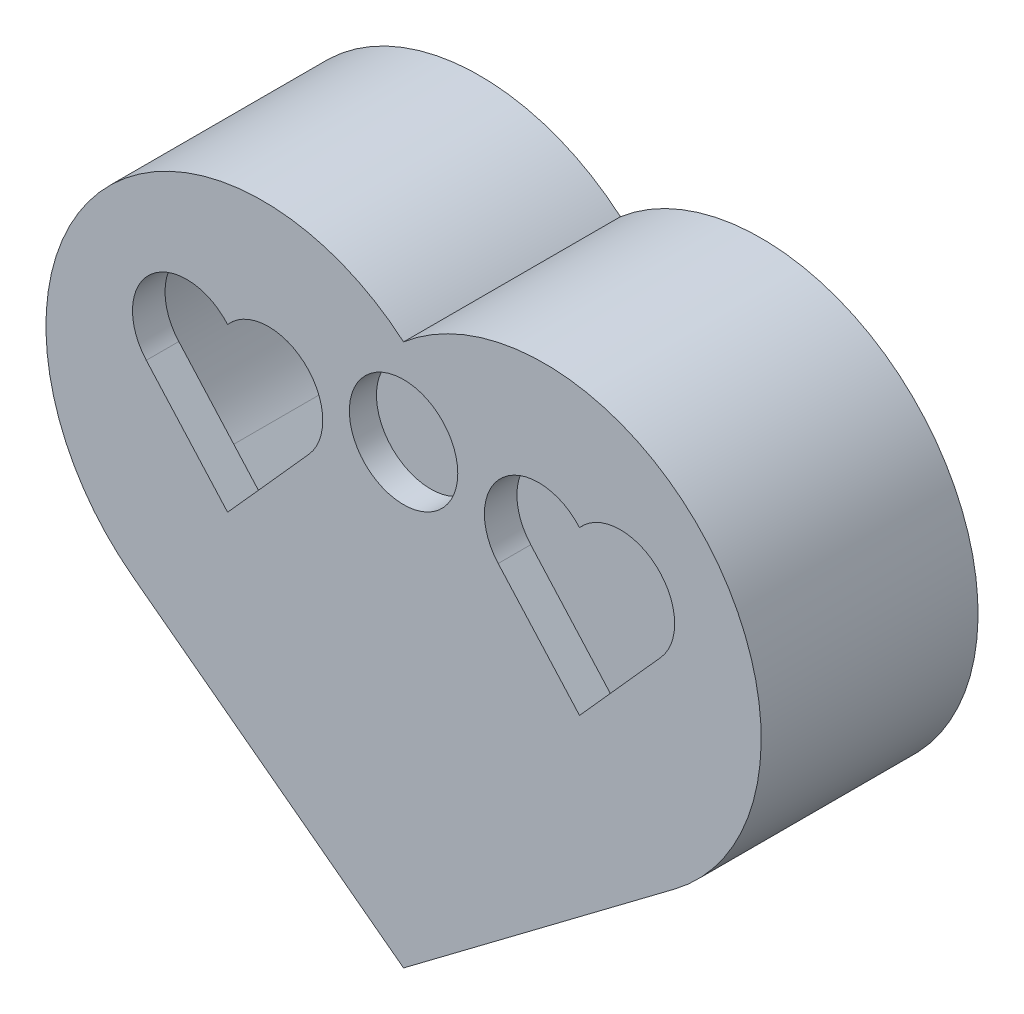
ISO-10303-21;
HEADER;
FILE_DESCRIPTION(('STEP AP214'),'2;1');
FILE_NAME('part.step','',(''),(''),'','','');
FILE_SCHEMA(('AUTOMOTIVE_DESIGN { 1 0 10303 214 1 1 1 1 }'));
ENDSEC;
DATA;
#1=APPLICATION_CONTEXT('core data for automotive mechanical design processes');
#2=APPLICATION_PROTOCOL_DEFINITION('international standard','automotive_design',2000,#1);
#3=PRODUCT_CONTEXT('',#1,'mechanical');
#4=PRODUCT('Part','Part','',(#3));
#5=PRODUCT_RELATED_PRODUCT_CATEGORY('part','',(#4));
#6=PRODUCT_DEFINITION_FORMATION('','',#4);
#7=PRODUCT_DEFINITION_CONTEXT('part definition',#1,'design');
#8=PRODUCT_DEFINITION('design','',#6,#7);
#9=PRODUCT_DEFINITION_SHAPE('','',#8);
#10=(LENGTH_UNIT() NAMED_UNIT(*) SI_UNIT(.MILLI.,.METRE.));
#11=(NAMED_UNIT(*) PLANE_ANGLE_UNIT() SI_UNIT($,.RADIAN.));
#12=(NAMED_UNIT(*) SI_UNIT($,.STERADIAN.) SOLID_ANGLE_UNIT());
#13=UNCERTAINTY_MEASURE_WITH_UNIT(LENGTH_MEASURE(1.E-05),#10,'distance_accuracy_value','');
#14=(GEOMETRIC_REPRESENTATION_CONTEXT(3) GLOBAL_UNCERTAINTY_ASSIGNED_CONTEXT((#13)) GLOBAL_UNIT_ASSIGNED_CONTEXT((#10,
#11,#12)) REPRESENTATION_CONTEXT('',''));
#15=CARTESIAN_POINT('',(0.,0.,0.));
#16=DIRECTION('',(0.,0.,1.));
#17=DIRECTION('',(1.,0.,0.));
#18=AXIS2_PLACEMENT_3D('',#15,#16,#17);
#19=CARTESIAN_POINT('',(-12.1768680961466,52.9084341167665,10.));
#20=DIRECTION('',(0.,0.,-1.));
#21=DIRECTION('',(-1.,0.,0.));
#22=AXIS2_PLACEMENT_3D('',#19,#20,#21);
#23=CYLINDRICAL_SURFACE('',#22,20.0000000000001);
#24=CARTESIAN_POINT('',(-12.1768680961466,52.9084341167665,-10.));
#25=DIRECTION('',(0.,0.,1.));
#26=DIRECTION('',(-1.,0.,0.));
#27=AXIS2_PLACEMENT_3D('',#24,#25,#26);
#28=CIRCLE('',#27,20.0000000000001);
#29=CARTESIAN_POINT('',(0.802992861017529,68.1243208649218,-10.));
#30=VERTEX_POINT('',#29);
#31=CARTESIAN_POINT('',(-24.1970071389825,36.9235582213804,-10.));
#32=VERTEX_POINT('',#31);
#33=EDGE_CURVE('E332',#30,#32,#28,.T.);
#34=ORIENTED_EDGE('',*,*,#33,.T.);
#35=DIRECTION('',(0.,0.,-1.));
#36=VECTOR('',#35,1.);
#37=CARTESIAN_POINT('',(-24.1970071389825,36.9235582213804,10.));
#38=LINE('',#37,#36);
#39=CARTESIAN_POINT('',(-24.1970071389825,36.9235582213804,10.));
#40=VERTEX_POINT('',#39);
#41=EDGE_CURVE('E361',#40,#32,#38,.T.);
#42=ORIENTED_EDGE('',*,*,#41,.F.);
#43=CARTESIAN_POINT('',(-12.1768680961466,52.9084341167665,10.));
#44=DIRECTION('',(0.,0.,1.));
#45=DIRECTION('',(-1.,0.,0.));
#46=AXIS2_PLACEMENT_3D('',#43,#44,#45);
#47=CIRCLE('',#46,20.0000000000001);
#48=CARTESIAN_POINT('',(0.802992861017529,68.1243208649218,10.));
#49=VERTEX_POINT('',#48);
#50=EDGE_CURVE('E335',#49,#40,#47,.T.);
#51=ORIENTED_EDGE('',*,*,#50,.F.);
#52=DIRECTION('',(0.,0.,-1.));
#53=VECTOR('',#52,1.);
#54=CARTESIAN_POINT('',(0.802992861017529,68.1243208649218,10.));
#55=LINE('',#54,#53);
#56=EDGE_CURVE('E345',#49,#30,#55,.T.);
#57=ORIENTED_EDGE('',*,*,#56,.T.);
#58=EDGE_LOOP('',(#34,#42,#51,#57));
#59=FACE_BOUND('',#58,.T.);
#60=ADVANCED_FACE('F36',(#59),#23,.T.);
#61=CARTESIAN_POINT('',(-24.1970071389825,36.9235582213804,10.));
#62=DIRECTION('',(0.601006952141792,0.799243794769302,0.));
#63=DIRECTION('',(-0.799243794769302,0.601006952141792,0.));
#64=AXIS2_PLACEMENT_3D('',#61,#62,#63);
#65=PLANE('',#64);
#66=DIRECTION('',(0.799243794769302,-0.601006952141792,0.));
#67=VECTOR('',#66,1.);
#68=CARTESIAN_POINT('',(-24.1970071389825,36.9235582213804,-10.));
#69=LINE('',#68,#67);
#70=CARTESIAN_POINT('',(0.802992861017527,18.1243208649218,-10.));
#71=VERTEX_POINT('',#70);
#72=EDGE_CURVE('E348',#32,#71,#69,.T.);
#73=ORIENTED_EDGE('',*,*,#72,.T.);
#74=DIRECTION('',(0.,0.,-1.));
#75=VECTOR('',#74,1.);
#76=CARTESIAN_POINT('',(0.802992861017527,18.1243208649218,10.));
#77=LINE('',#76,#75);
#78=CARTESIAN_POINT('',(0.802992861017527,18.1243208649218,10.));
#79=VERTEX_POINT('',#78);
#80=EDGE_CURVE('E358',#79,#71,#77,.T.);
#81=ORIENTED_EDGE('',*,*,#80,.F.);
#82=DIRECTION('',(0.799243794769302,-0.601006952141792,0.));
#83=VECTOR('',#82,1.);
#84=CARTESIAN_POINT('',(-24.1970071389825,36.9235582213804,10.));
#85=LINE('',#84,#83);
#86=EDGE_CURVE('E338',#40,#79,#85,.T.);
#87=ORIENTED_EDGE('',*,*,#86,.F.);
#88=ORIENTED_EDGE('',*,*,#41,.T.);
#89=EDGE_LOOP('',(#73,#81,#87,#88));
#90=FACE_BOUND('',#89,.T.);
#91=ADVANCED_FACE('F402',(#90),#65,.F.);
#92=CARTESIAN_POINT('',(0.802992861017527,18.1243208649218,10.));
#93=DIRECTION('',(-0.601006952141793,0.799243794769301,0.));
#94=DIRECTION('',(-0.799243794769301,-0.601006952141793,0.));
#95=AXIS2_PLACEMENT_3D('',#92,#93,#94);
#96=PLANE('',#95);
#97=DIRECTION('',(0.799243794769301,0.601006952141793,0.));
#98=VECTOR('',#97,1.);
#99=CARTESIAN_POINT('',(0.802992861017527,18.1243208649218,-10.));
#100=LINE('',#99,#98);
#101=CARTESIAN_POINT('',(25.8029928610175,36.9235582213804,-10.));
#102=VERTEX_POINT('',#101);
#103=EDGE_CURVE('E350',#71,#102,#100,.T.);
#104=ORIENTED_EDGE('',*,*,#103,.T.);
#105=DIRECTION('',(0.,0.,-1.));
#106=VECTOR('',#105,1.);
#107=CARTESIAN_POINT('',(25.8029928610175,36.9235582213804,10.));
#108=LINE('',#107,#106);
#109=CARTESIAN_POINT('',(25.8029928610175,36.9235582213804,10.));
#110=VERTEX_POINT('',#109);
#111=EDGE_CURVE('E355',#110,#102,#108,.T.);
#112=ORIENTED_EDGE('',*,*,#111,.F.);
#113=DIRECTION('',(0.799243794769301,0.601006952141793,0.));
#114=VECTOR('',#113,1.);
#115=CARTESIAN_POINT('',(0.802992861017527,18.1243208649218,10.));
#116=LINE('',#115,#114);
#117=EDGE_CURVE('E341',#79,#110,#116,.T.);
#118=ORIENTED_EDGE('',*,*,#117,.F.);
#119=ORIENTED_EDGE('',*,*,#80,.T.);
#120=EDGE_LOOP('',(#104,#112,#118,#119));
#121=FACE_BOUND('',#120,.T.);
#122=ADVANCED_FACE('F407',(#121),#96,.F.);
#123=CARTESIAN_POINT('',(13.7828538181817,52.9084341167665,10.));
#124=DIRECTION('',(0.,0.,-1.));
#125=DIRECTION('',(-1.,0.,0.));
#126=AXIS2_PLACEMENT_3D('',#123,#124,#125);
#127=CYLINDRICAL_SURFACE('',#126,20.);
#128=CARTESIAN_POINT('',(13.7828538181817,52.9084341167665,-10.));
#129=DIRECTION('',(0.,0.,1.));
#130=DIRECTION('',(1.,0.,0.));
#131=AXIS2_PLACEMENT_3D('',#128,#129,#130);
#132=CIRCLE('',#131,20.);
#133=EDGE_CURVE('E339',#102,#30,#132,.T.);
#134=ORIENTED_EDGE('',*,*,#133,.T.);
#135=ORIENTED_EDGE('',*,*,#56,.F.);
#136=CARTESIAN_POINT('',(13.7828538181817,52.9084341167665,10.));
#137=DIRECTION('',(0.,0.,1.));
#138=DIRECTION('',(1.,0.,0.));
#139=AXIS2_PLACEMENT_3D('',#136,#137,#138);
#140=CIRCLE('',#139,20.);
#141=EDGE_CURVE('E343',#110,#49,#140,.T.);
#142=ORIENTED_EDGE('',*,*,#141,.F.);
#143=ORIENTED_EDGE('',*,*,#111,.T.);
#144=EDGE_LOOP('',(#134,#135,#142,#143));
#145=FACE_BOUND('',#144,.T.);
#146=ADVANCED_FACE('F423',(#145),#127,.T.);
#147=CARTESIAN_POINT('',(-12.1768680961466,52.9084341167665,10.));
#148=DIRECTION('',(0.,0.,-1.));
#149=DIRECTION('',(-1.,0.,0.));
#150=AXIS2_PLACEMENT_3D('',#147,#148,#149);
#151=PLANE('',#150);
#152=CARTESIAN_POINT('',(-19.1970071389825,58.1243208649218,10.));
#153=DIRECTION('',(0.,0.,-1.));
#154=DIRECTION('',(-1.,0.,0.));
#155=AXIS2_PLACEMENT_3D('',#152,#153,#154);
#156=CIRCLE('',#155,5.);
#157=CARTESIAN_POINT('',(-22.9239322435525,54.7911498124665,10.));
#158=VERTEX_POINT('',#157);
#159=CARTESIAN_POINT('',(-15.4239322435525,61.40516006145,10.));
#160=VERTEX_POINT('',#159);
#161=EDGE_CURVE('E219',#158,#160,#156,.T.);
#162=ORIENTED_EDGE('',*,*,#161,.T.);
#163=CARTESIAN_POINT('',(-11.6508573481225,58.1243208649218,10.));
#164=DIRECTION('',(0.,0.,-1.));
#165=DIRECTION('',(1.,0.,0.));
#166=AXIS2_PLACEMENT_3D('',#163,#164,#165);
#167=CIRCLE('',#166,5.);
#168=CARTESIAN_POINT('',(-7.92393224355246,54.7911498124665,10.));
#169=VERTEX_POINT('',#168);
#170=EDGE_CURVE('E203',#160,#169,#167,.T.);
#171=ORIENTED_EDGE('',*,*,#170,.T.);
#172=DIRECTION('',(-0.666634210491059,-0.745385020913999,0.));
#173=VECTOR('',#172,1.);
#174=CARTESIAN_POINT('',(-7.92393224355246,54.7911498124665,10.));
#175=LINE('',#174,#173);
#176=CARTESIAN_POINT('',(-15.4239322435525,46.40516006145,10.));
#177=VERTEX_POINT('',#176);
#178=EDGE_CURVE('E211',#169,#177,#175,.T.);
#179=ORIENTED_EDGE('',*,*,#178,.T.);
#180=DIRECTION('',(-0.666634210491059,0.745385020913999,0.));
#181=VECTOR('',#180,1.);
#182=CARTESIAN_POINT('',(-15.4239322435525,46.40516006145,10.));
#183=LINE('',#182,#181);
#184=EDGE_CURVE('E50',#177,#158,#183,.T.);
#185=ORIENTED_EDGE('',*,*,#184,.T.);
#186=EDGE_LOOP('',(#162,#171,#179,#185));
#187=FACE_BOUND('',#186,.T.);
#188=DIRECTION('',(-0.666634210491059,0.745385020913999,0.));
#189=VECTOR('',#188,1.);
#190=CARTESIAN_POINT('',(17.0299179655875,46.40516006145,10.));
#191=LINE('',#190,#189);
#192=CARTESIAN_POINT('',(17.0299179655875,46.40516006145,10.));
#193=VERTEX_POINT('',#192);
#194=CARTESIAN_POINT('',(9.52991796558753,54.7911498124665,10.));
#195=VERTEX_POINT('',#194);
#196=EDGE_CURVE('E253',#193,#195,#191,.T.);
#197=ORIENTED_EDGE('',*,*,#196,.T.);
#198=CARTESIAN_POINT('',(13.2568430701575,58.1243208649218,10.));
#199=DIRECTION('',(0.,0.,-1.));
#200=DIRECTION('',(-1.,0.,0.));
#201=AXIS2_PLACEMENT_3D('',#198,#199,#200);
#202=CIRCLE('',#201,5.);
#203=CARTESIAN_POINT('',(17.0299179655875,61.40516006145,10.));
#204=VERTEX_POINT('',#203);
#205=EDGE_CURVE('E245',#195,#204,#202,.T.);
#206=ORIENTED_EDGE('',*,*,#205,.T.);
#207=CARTESIAN_POINT('',(20.8029928610175,58.1243208649218,10.));
#208=DIRECTION('',(0.,0.,-1.));
#209=DIRECTION('',(1.,0.,0.));
#210=AXIS2_PLACEMENT_3D('',#207,#208,#209);
#211=CIRCLE('',#210,5.);
#212=CARTESIAN_POINT('',(24.5299179655875,54.7911498124665,10.));
#213=VERTEX_POINT('',#212);
#214=EDGE_CURVE('E248',#204,#213,#211,.T.);
#215=ORIENTED_EDGE('',*,*,#214,.T.);
#216=DIRECTION('',(-0.666634210491058,-0.745385020913999,0.));
#217=VECTOR('',#216,1.);
#218=CARTESIAN_POINT('',(17.0299179655875,46.40516006145,10.));
#219=LINE('',#218,#217);
#220=EDGE_CURVE('E58',#213,#193,#219,.T.);
#221=ORIENTED_EDGE('',*,*,#220,.T.);
#222=EDGE_LOOP('',(#197,#206,#215,#221));
#223=FACE_BOUND('',#222,.T.);
#224=CARTESIAN_POINT('',(0.80299286101753,60.1243208649218,10.));
#225=DIRECTION('',(0.,0.,1.));
#226=DIRECTION('',(1.,0.,0.));
#227=AXIS2_PLACEMENT_3D('',#224,#225,#226);
#228=CIRCLE('',#227,5.);
#229=CARTESIAN_POINT('',(5.80299286101753,60.1243208649218,10.));
#230=VERTEX_POINT('',#229);
#231=EDGE_CURVE('E323',#230,#230,#228,.T.);
#232=ORIENTED_EDGE('',*,*,#231,.F.);
#233=EDGE_LOOP('',(#232));
#234=FACE_BOUND('',#233,.T.);
#235=ORIENTED_EDGE('',*,*,#50,.T.);
#236=ORIENTED_EDGE('',*,*,#86,.T.);
#237=ORIENTED_EDGE('',*,*,#117,.T.);
#238=ORIENTED_EDGE('',*,*,#141,.T.);
#239=EDGE_LOOP('',(#235,#236,#237,#238));
#240=FACE_BOUND('',#239,.T.);
#241=ADVANCED_FACE('F216',(#187,#223,#234,#240),#151,.F.);
#242=CARTESIAN_POINT('',(-12.1768680961466,52.9084341167665,-10.));
#243=DIRECTION('',(0.,0.,-1.));
#244=DIRECTION('',(-1.,0.,0.));
#245=AXIS2_PLACEMENT_3D('',#242,#243,#244);
#246=PLANE('',#245);
#247=CARTESIAN_POINT('',(-11.6508573481225,58.1243208649218,-10.));
#248=DIRECTION('',(0.,0.,-1.));
#249=DIRECTION('',(1.,0.,0.));
#250=AXIS2_PLACEMENT_3D('',#247,#248,#249);
#251=CIRCLE('',#250,5.);
#252=CARTESIAN_POINT('',(-15.4239322435525,61.40516006145,-10.));
#253=VERTEX_POINT('',#252);
#254=CARTESIAN_POINT('',(-7.92393224355246,54.7911498124665,-10.));
#255=VERTEX_POINT('',#254);
#256=EDGE_CURVE('E228',#253,#255,#251,.T.);
#257=ORIENTED_EDGE('',*,*,#256,.F.);
#258=CARTESIAN_POINT('',(-19.1970071389825,58.1243208649218,-10.));
#259=DIRECTION('',(0.,0.,-1.));
#260=DIRECTION('',(-1.,0.,0.));
#261=AXIS2_PLACEMENT_3D('',#258,#259,#260);
#262=CIRCLE('',#261,5.);
#263=CARTESIAN_POINT('',(-22.9239322435525,54.7911498124665,-10.));
#264=VERTEX_POINT('',#263);
#265=EDGE_CURVE('E220',#264,#253,#262,.T.);
#266=ORIENTED_EDGE('',*,*,#265,.F.);
#267=DIRECTION('',(-0.666634210491059,0.745385020913999,0.));
#268=VECTOR('',#267,1.);
#269=CARTESIAN_POINT('',(-15.4239322435525,46.40516006145,-10.));
#270=LINE('',#269,#268);
#271=CARTESIAN_POINT('',(-15.4239322435525,46.40516006145,-10.));
#272=VERTEX_POINT('',#271);
#273=EDGE_CURVE('E223',#272,#264,#270,.T.);
#274=ORIENTED_EDGE('',*,*,#273,.F.);
#275=DIRECTION('',(-0.666634210491059,-0.745385020913999,0.));
#276=VECTOR('',#275,1.);
#277=CARTESIAN_POINT('',(-7.92393224355246,54.7911498124665,-10.));
#278=LINE('',#277,#276);
#279=EDGE_CURVE('E230',#255,#272,#278,.T.);
#280=ORIENTED_EDGE('',*,*,#279,.F.);
#281=EDGE_LOOP('',(#257,#266,#274,#280));
#282=FACE_BOUND('',#281,.T.);
#283=CARTESIAN_POINT('',(13.2568430701575,58.1243208649218,-10.));
#284=DIRECTION('',(0.,0.,-1.));
#285=DIRECTION('',(-1.,0.,0.));
#286=AXIS2_PLACEMENT_3D('',#283,#284,#285);
#287=CIRCLE('',#286,5.);
#288=CARTESIAN_POINT('',(9.52991796558753,54.7911498124665,-10.));
#289=VERTEX_POINT('',#288);
#290=CARTESIAN_POINT('',(17.0299179655875,61.40516006145,-10.));
#291=VERTEX_POINT('',#290);
#292=EDGE_CURVE('E257',#289,#291,#287,.T.);
#293=ORIENTED_EDGE('',*,*,#292,.F.);
#294=DIRECTION('',(-0.666634210491059,0.745385020913999,0.));
#295=VECTOR('',#294,1.);
#296=CARTESIAN_POINT('',(17.0299179655875,46.40516006145,-10.));
#297=LINE('',#296,#295);
#298=CARTESIAN_POINT('',(17.0299179655875,46.40516006145,-10.));
#299=VERTEX_POINT('',#298);
#300=EDGE_CURVE('E249',#299,#289,#297,.T.);
#301=ORIENTED_EDGE('',*,*,#300,.F.);
#302=DIRECTION('',(-0.666634210491058,-0.745385020913999,0.));
#303=VECTOR('',#302,1.);
#304=CARTESIAN_POINT('',(17.0299179655875,46.40516006145,-10.));
#305=LINE('',#304,#303);
#306=CARTESIAN_POINT('',(24.5299179655875,54.7911498124665,-10.));
#307=VERTEX_POINT('',#306);
#308=EDGE_CURVE('E262',#307,#299,#305,.T.);
#309=ORIENTED_EDGE('',*,*,#308,.F.);
#310=CARTESIAN_POINT('',(20.8029928610175,58.1243208649218,-10.));
#311=DIRECTION('',(0.,0.,-1.));
#312=DIRECTION('',(1.,0.,0.));
#313=AXIS2_PLACEMENT_3D('',#310,#311,#312);
#314=CIRCLE('',#313,5.);
#315=EDGE_CURVE('E259',#291,#307,#314,.T.);
#316=ORIENTED_EDGE('',*,*,#315,.F.);
#317=EDGE_LOOP('',(#293,#301,#309,#316));
#318=FACE_BOUND('',#317,.T.);
#319=ORIENTED_EDGE('',*,*,#33,.F.);
#320=ORIENTED_EDGE('',*,*,#133,.F.);
#321=ORIENTED_EDGE('',*,*,#103,.F.);
#322=ORIENTED_EDGE('',*,*,#72,.F.);
#323=EDGE_LOOP('',(#319,#320,#321,#322));
#324=FACE_BOUND('',#323,.T.);
#325=ADVANCED_FACE('F415',(#282,#318,#324),#246,.T.);
#326=CARTESIAN_POINT('',(0.80299286101753,60.1243208649218,7.5));
#327=DIRECTION('',(0.,0.,1.));
#328=DIRECTION('',(1.,0.,0.));
#329=AXIS2_PLACEMENT_3D('',#326,#327,#328);
#330=CYLINDRICAL_SURFACE('',#329,5.);
#331=CARTESIAN_POINT('',(0.80299286101753,60.1243208649218,7.5));
#332=DIRECTION('',(0.,0.,1.));
#333=DIRECTION('',(1.,0.,0.));
#334=AXIS2_PLACEMENT_3D('',#331,#332,#333);
#335=CIRCLE('',#334,5.);
#336=CARTESIAN_POINT('',(5.80299286101753,60.1243208649218,7.5));
#337=VERTEX_POINT('',#336);
#338=EDGE_CURVE('E329',#337,#337,#335,.T.);
#339=ORIENTED_EDGE('',*,*,#338,.F.);
#340=EDGE_LOOP('',(#339));
#341=FACE_BOUND('',#340,.T.);
#342=ORIENTED_EDGE('',*,*,#231,.T.);
#343=EDGE_LOOP('',(#342));
#344=FACE_BOUND('',#343,.T.);
#345=ADVANCED_FACE('F434',(#341,#344),#330,.F.);
#346=CARTESIAN_POINT('',(0.80299286101753,60.1243208649218,7.5));
#347=DIRECTION('',(0.,0.,1.));
#348=DIRECTION('',(1.,0.,0.));
#349=AXIS2_PLACEMENT_3D('',#346,#347,#348);
#350=PLANE('',#349);
#351=ORIENTED_EDGE('',*,*,#338,.T.);
#352=EDGE_LOOP('',(#351));
#353=FACE_BOUND('',#352,.T.);
#354=ADVANCED_FACE('F440',(#353),#350,.T.);
#355=CARTESIAN_POINT('',(20.8029928610175,58.1243208649218,10.));
#356=DIRECTION('',(0.,0.,-1.));
#357=DIRECTION('',(-1.,0.,0.));
#358=AXIS2_PLACEMENT_3D('',#355,#356,#357);
#359=CYLINDRICAL_SURFACE('',#358,5.);
#360=DIRECTION('',(0.,0.,-1.));
#361=VECTOR('',#360,1.);
#362=CARTESIAN_POINT('',(24.5299179655875,54.7911498124665,10.));
#363=LINE('',#362,#361);
#364=CARTESIAN_POINT('',(24.5299179655875,54.7911498124665,7.));
#365=VERTEX_POINT('',#364);
#366=EDGE_CURVE('E274',#213,#365,#363,.T.);
#367=ORIENTED_EDGE('',*,*,#366,.F.);
#368=ORIENTED_EDGE('',*,*,#214,.F.);
#369=DIRECTION('',(0.,0.,-1.));
#370=VECTOR('',#369,1.);
#371=CARTESIAN_POINT('',(17.0299179655875,61.40516006145,10.));
#372=LINE('',#371,#370);
#373=CARTESIAN_POINT('',(17.0299179655875,61.40516006145,7.));
#374=VERTEX_POINT('',#373);
#375=EDGE_CURVE('E277',#204,#374,#372,.T.);
#376=ORIENTED_EDGE('',*,*,#375,.T.);
#377=CARTESIAN_POINT('',(20.8029928610175,58.1243208649218,7.));
#378=DIRECTION('',(0.,0.,1.));
#379=DIRECTION('',(1.,0.,0.));
#380=AXIS2_PLACEMENT_3D('',#377,#378,#379);
#381=CIRCLE('',#380,5.);
#382=EDGE_CURVE('E364',#365,#374,#381,.T.);
#383=ORIENTED_EDGE('',*,*,#382,.F.);
#384=EDGE_LOOP('',(#367,#368,#376,#383));
#385=FACE_BOUND('',#384,.T.);
#386=ADVANCED_FACE('F444',(#385),#359,.F.);
#387=CARTESIAN_POINT('',(17.0299179655875,46.40516006145,10.));
#388=DIRECTION('',(0.745385020913999,-0.666634210491058,0.));
#389=DIRECTION('',(0.666634210491058,0.745385020913999,0.));
#390=AXIS2_PLACEMENT_3D('',#387,#388,#389);
#391=PLANE('',#390);
#392=DIRECTION('',(0.,0.,-1.));
#393=VECTOR('',#392,1.);
#394=CARTESIAN_POINT('',(17.0299179655875,46.40516006145,10.));
#395=LINE('',#394,#393);
#396=CARTESIAN_POINT('',(17.0299179655875,46.40516006145,7.));
#397=VERTEX_POINT('',#396);
#398=EDGE_CURVE('E270',#193,#397,#395,.T.);
#399=ORIENTED_EDGE('',*,*,#398,.F.);
#400=ORIENTED_EDGE('',*,*,#220,.F.);
#401=ORIENTED_EDGE('',*,*,#366,.T.);
#402=DIRECTION('',(0.666634210491058,0.745385020913999,0.));
#403=VECTOR('',#402,1.);
#404=CARTESIAN_POINT('',(19.2597266663499,48.8983804496261,7.));
#405=LINE('',#404,#403);
#406=EDGE_CURVE('E367',#397,#365,#405,.T.);
#407=ORIENTED_EDGE('',*,*,#406,.F.);
#408=EDGE_LOOP('',(#399,#400,#401,#407));
#409=FACE_BOUND('',#408,.T.);
#410=ADVANCED_FACE('F482',(#409),#391,.F.);
#411=CARTESIAN_POINT('',(17.0299179655875,46.40516006145,10.));
#412=DIRECTION('',(-0.745385020913999,-0.666634210491059,0.));
#413=DIRECTION('',(0.666634210491059,-0.745385020913999,0.));
#414=AXIS2_PLACEMENT_3D('',#411,#412,#413);
#415=PLANE('',#414);
#416=DIRECTION('',(0.,0.,-1.));
#417=VECTOR('',#416,1.);
#418=CARTESIAN_POINT('',(9.52991796558753,54.7911498124665,10.));
#419=LINE('',#418,#417);
#420=CARTESIAN_POINT('',(9.52991796558753,54.7911498124665,7.));
#421=VERTEX_POINT('',#420);
#422=EDGE_CURVE('E231',#195,#421,#419,.T.);
#423=ORIENTED_EDGE('',*,*,#422,.F.);
#424=ORIENTED_EDGE('',*,*,#196,.F.);
#425=ORIENTED_EDGE('',*,*,#398,.T.);
#426=DIRECTION('',(0.666634210491059,-0.745385020913999,0.));
#427=VECTOR('',#426,1.);
#428=CARTESIAN_POINT('',(10.4381336431788,53.7756448306008,7.));
#429=LINE('',#428,#427);
#430=EDGE_CURVE('E370',#421,#397,#429,.T.);
#431=ORIENTED_EDGE('',*,*,#430,.F.);
#432=EDGE_LOOP('',(#423,#424,#425,#431));
#433=FACE_BOUND('',#432,.T.);
#434=ADVANCED_FACE('F486',(#433),#415,.F.);
#435=CARTESIAN_POINT('',(13.2568430701575,58.1243208649218,10.));
#436=DIRECTION('',(0.,0.,-1.));
#437=DIRECTION('',(-1.,0.,0.));
#438=AXIS2_PLACEMENT_3D('',#435,#436,#437);
#439=CYLINDRICAL_SURFACE('',#438,5.);
#440=ORIENTED_EDGE('',*,*,#375,.F.);
#441=ORIENTED_EDGE('',*,*,#205,.F.);
#442=ORIENTED_EDGE('',*,*,#422,.T.);
#443=CARTESIAN_POINT('',(13.2568430701575,58.1243208649218,7.));
#444=DIRECTION('',(0.,0.,1.));
#445=DIRECTION('',(1.,0.,0.));
#446=AXIS2_PLACEMENT_3D('',#443,#444,#445);
#447=CIRCLE('',#446,5.);
#448=EDGE_CURVE('E373',#374,#421,#447,.T.);
#449=ORIENTED_EDGE('',*,*,#448,.F.);
#450=EDGE_LOOP('',(#440,#441,#442,#449));
#451=FACE_BOUND('',#450,.T.);
#452=ADVANCED_FACE('F396',(#451),#439,.F.);
#453=CARTESIAN_POINT('',(-7.92393224355246,54.7911498124665,10.));
#454=DIRECTION('',(0.745385020913999,-0.666634210491059,0.));
#455=DIRECTION('',(0.666634210491059,0.745385020913999,0.));
#456=AXIS2_PLACEMENT_3D('',#453,#454,#455);
#457=PLANE('',#456);
#458=DIRECTION('',(0.,0.,-1.));
#459=VECTOR('',#458,1.);
#460=CARTESIAN_POINT('',(-15.4239322435525,46.40516006145,10.));
#461=LINE('',#460,#459);
#462=CARTESIAN_POINT('',(-15.4239322435525,46.40516006145,7.));
#463=VERTEX_POINT('',#462);
#464=EDGE_CURVE('E213',#177,#463,#461,.T.);
#465=ORIENTED_EDGE('',*,*,#464,.F.);
#466=ORIENTED_EDGE('',*,*,#178,.F.);
#467=DIRECTION('',(0.,0.,-1.));
#468=VECTOR('',#467,1.);
#469=CARTESIAN_POINT('',(-7.92393224355246,54.7911498124665,10.));
#470=LINE('',#469,#468);
#471=CARTESIAN_POINT('',(-7.92393224355246,54.7911498124665,7.));
#472=VERTEX_POINT('',#471);
#473=EDGE_CURVE('E198',#169,#472,#470,.T.);
#474=ORIENTED_EDGE('',*,*,#473,.T.);
#475=DIRECTION('',(0.666634210491059,0.745385020913999,0.));
#476=VECTOR('',#475,1.);
#477=CARTESIAN_POINT('',(1.22840548053262,65.0246711927357,7.));
#478=LINE('',#477,#476);
#479=EDGE_CURVE('E376',#463,#472,#478,.T.);
#480=ORIENTED_EDGE('',*,*,#479,.F.);
#481=EDGE_LOOP('',(#465,#466,#474,#480));
#482=FACE_BOUND('',#481,.T.);
#483=ADVANCED_FACE('F212',(#482),#457,.F.);
#484=CARTESIAN_POINT('',(-15.4239322435525,46.40516006145,10.));
#485=DIRECTION('',(-0.745385020913999,-0.666634210491059,0.));
#486=DIRECTION('',(0.666634210491059,-0.745385020913999,0.));
#487=AXIS2_PLACEMENT_3D('',#484,#485,#486);
#488=PLANE('',#487);
#489=DIRECTION('',(0.,0.,-1.));
#490=VECTOR('',#489,1.);
#491=CARTESIAN_POINT('',(-22.9239322435525,54.7911498124665,10.));
#492=LINE('',#491,#490);
#493=CARTESIAN_POINT('',(-22.9239322435525,54.7911498124665,7.));
#494=VERTEX_POINT('',#493);
#495=EDGE_CURVE('E240',#158,#494,#492,.T.);
#496=ORIENTED_EDGE('',*,*,#495,.F.);
#497=ORIENTED_EDGE('',*,*,#184,.F.);
#498=ORIENTED_EDGE('',*,*,#464,.T.);
#499=DIRECTION('',(0.666634210491059,-0.745385020913999,0.));
#500=VECTOR('',#499,1.);
#501=CARTESIAN_POINT('',(-7.59318754263853,37.6493540874912,7.));
#502=LINE('',#501,#500);
#503=EDGE_CURVE('E378',#494,#463,#502,.T.);
#504=ORIENTED_EDGE('',*,*,#503,.F.);
#505=EDGE_LOOP('',(#496,#497,#498,#504));
#506=FACE_BOUND('',#505,.T.);
#507=ADVANCED_FACE('F386',(#506),#488,.F.);
#508=CARTESIAN_POINT('',(-19.1970071389825,58.1243208649218,10.));
#509=DIRECTION('',(0.,0.,-1.));
#510=DIRECTION('',(-1.,0.,0.));
#511=AXIS2_PLACEMENT_3D('',#508,#509,#510);
#512=CYLINDRICAL_SURFACE('',#511,5.);
#513=DIRECTION('',(0.,0.,-1.));
#514=VECTOR('',#513,1.);
#515=CARTESIAN_POINT('',(-15.4239322435525,61.40516006145,10.));
#516=LINE('',#515,#514);
#517=CARTESIAN_POINT('',(-15.4239322435525,61.40516006145,7.));
#518=VERTEX_POINT('',#517);
#519=EDGE_CURVE('E236',#160,#518,#516,.T.);
#520=ORIENTED_EDGE('',*,*,#519,.F.);
#521=ORIENTED_EDGE('',*,*,#161,.F.);
#522=ORIENTED_EDGE('',*,*,#495,.T.);
#523=CARTESIAN_POINT('',(-19.1970071389825,58.1243208649218,7.));
#524=DIRECTION('',(0.,0.,1.));
#525=DIRECTION('',(1.,0.,0.));
#526=AXIS2_PLACEMENT_3D('',#523,#524,#525);
#527=CIRCLE('',#526,5.);
#528=EDGE_CURVE('E43',#518,#494,#527,.T.);
#529=ORIENTED_EDGE('',*,*,#528,.F.);
#530=EDGE_LOOP('',(#520,#521,#522,#529));
#531=FACE_BOUND('',#530,.T.);
#532=ADVANCED_FACE('F385',(#531),#512,.F.);
#533=CARTESIAN_POINT('',(-11.6508573481225,58.1243208649218,10.));
#534=DIRECTION('',(0.,0.,-1.));
#535=DIRECTION('',(-1.,0.,0.));
#536=AXIS2_PLACEMENT_3D('',#533,#534,#535);
#537=CYLINDRICAL_SURFACE('',#536,5.);
#538=ORIENTED_EDGE('',*,*,#473,.F.);
#539=ORIENTED_EDGE('',*,*,#170,.F.);
#540=ORIENTED_EDGE('',*,*,#519,.T.);
#541=CARTESIAN_POINT('',(-11.6508573481225,58.1243208649218,7.));
#542=DIRECTION('',(0.,0.,1.));
#543=DIRECTION('',(1.,0.,0.));
#544=AXIS2_PLACEMENT_3D('',#541,#542,#543);
#545=CIRCLE('',#544,5.);
#546=EDGE_CURVE('E11',#472,#518,#545,.T.);
#547=ORIENTED_EDGE('',*,*,#546,.F.);
#548=EDGE_LOOP('',(#538,#539,#540,#547));
#549=FACE_BOUND('',#548,.T.);
#550=ADVANCED_FACE('F200',(#549),#537,.F.);
#551=CARTESIAN_POINT('',(13.2568430701575,58.1243208649218,-7.));
#552=DIRECTION('',(0.,0.,1.));
#553=DIRECTION('',(1.,0.,0.));
#554=AXIS2_PLACEMENT_3D('',#551,#552,#553);
#555=CIRCLE('',#554,5.);
#556=CARTESIAN_POINT('',(17.0299179655875,61.40516006145,-7.));
#557=VERTEX_POINT('',#556);
#558=CARTESIAN_POINT('',(9.52991796558753,54.7911498124665,-7.));
#559=VERTEX_POINT('',#558);
#560=EDGE_CURVE('E285',#557,#559,#555,.T.);
#561=ORIENTED_EDGE('',*,*,#560,.T.);
#562=EDGE_CURVE('E269',#559,#289,#419,.T.);
#563=ORIENTED_EDGE('',*,*,#562,.T.);
#564=ORIENTED_EDGE('',*,*,#292,.T.);
#565=EDGE_CURVE('E256',#557,#291,#372,.T.);
#566=ORIENTED_EDGE('',*,*,#565,.F.);
#567=EDGE_LOOP('',(#561,#563,#564,#566));
#568=FACE_BOUND('',#567,.T.);
#569=ADVANCED_FACE('F468',(#568),#439,.F.);
#570=DIRECTION('',(0.666634210491059,-0.745385020913999,0.));
#571=VECTOR('',#570,1.);
#572=CARTESIAN_POINT('',(10.4381336431788,53.7756448306008,-7.));
#573=LINE('',#572,#571);
#574=CARTESIAN_POINT('',(17.0299179655875,46.40516006145,-7.));
#575=VERTEX_POINT('',#574);
#576=EDGE_CURVE('E283',#559,#575,#573,.T.);
#577=ORIENTED_EDGE('',*,*,#576,.T.);
#578=EDGE_CURVE('E273',#575,#299,#395,.T.);
#579=ORIENTED_EDGE('',*,*,#578,.T.);
#580=ORIENTED_EDGE('',*,*,#300,.T.);
#581=ORIENTED_EDGE('',*,*,#562,.F.);
#582=EDGE_LOOP('',(#577,#579,#580,#581));
#583=FACE_BOUND('',#582,.T.);
#584=ADVANCED_FACE('F471',(#583),#415,.F.);
#585=DIRECTION('',(0.666634210491058,0.745385020913999,0.));
#586=VECTOR('',#585,1.);
#587=CARTESIAN_POINT('',(19.2597266663499,48.8983804496261,-7.));
#588=LINE('',#587,#586);
#589=CARTESIAN_POINT('',(24.5299179655875,54.7911498124665,-7.));
#590=VERTEX_POINT('',#589);
#591=EDGE_CURVE('E280',#575,#590,#588,.T.);
#592=ORIENTED_EDGE('',*,*,#591,.T.);
#593=EDGE_CURVE('E276',#590,#307,#363,.T.);
#594=ORIENTED_EDGE('',*,*,#593,.T.);
#595=ORIENTED_EDGE('',*,*,#308,.T.);
#596=ORIENTED_EDGE('',*,*,#578,.F.);
#597=EDGE_LOOP('',(#592,#594,#595,#596));
#598=FACE_BOUND('',#597,.T.);
#599=ADVANCED_FACE('F477',(#598),#391,.F.);
#600=CARTESIAN_POINT('',(20.8029928610175,58.1243208649218,-7.));
#601=DIRECTION('',(0.,0.,1.));
#602=DIRECTION('',(1.,0.,0.));
#603=AXIS2_PLACEMENT_3D('',#600,#601,#602);
#604=CIRCLE('',#603,5.);
#605=EDGE_CURVE('E238',#590,#557,#604,.T.);
#606=ORIENTED_EDGE('',*,*,#605,.T.);
#607=ORIENTED_EDGE('',*,*,#565,.T.);
#608=ORIENTED_EDGE('',*,*,#315,.T.);
#609=ORIENTED_EDGE('',*,*,#593,.F.);
#610=EDGE_LOOP('',(#606,#607,#608,#609));
#611=FACE_BOUND('',#610,.T.);
#612=ADVANCED_FACE('F473',(#611),#359,.F.);
#613=CARTESIAN_POINT('',(-11.6508573481225,58.1243208649218,-7.));
#614=DIRECTION('',(0.,0.,1.));
#615=DIRECTION('',(1.,0.,0.));
#616=AXIS2_PLACEMENT_3D('',#613,#614,#615);
#617=CIRCLE('',#616,5.);
#618=CARTESIAN_POINT('',(-7.92393224355246,54.7911498124665,-7.));
#619=VERTEX_POINT('',#618);
#620=CARTESIAN_POINT('',(-15.4239322435525,61.40516006145,-7.));
#621=VERTEX_POINT('',#620);
#622=EDGE_CURVE('E294',#619,#621,#617,.T.);
#623=ORIENTED_EDGE('',*,*,#622,.T.);
#624=EDGE_CURVE('E239',#621,#253,#516,.T.);
#625=ORIENTED_EDGE('',*,*,#624,.T.);
#626=ORIENTED_EDGE('',*,*,#256,.T.);
#627=EDGE_CURVE('E208',#619,#255,#470,.T.);
#628=ORIENTED_EDGE('',*,*,#627,.F.);
#629=EDGE_LOOP('',(#623,#625,#626,#628));
#630=FACE_BOUND('',#629,.T.);
#631=ADVANCED_FACE('F476',(#630),#537,.F.);
#632=CARTESIAN_POINT('',(-19.1970071389825,58.1243208649218,-7.));
#633=DIRECTION('',(0.,0.,1.));
#634=DIRECTION('',(1.,0.,0.));
#635=AXIS2_PLACEMENT_3D('',#632,#633,#634);
#636=CIRCLE('',#635,5.);
#637=CARTESIAN_POINT('',(-22.9239322435525,54.7911498124665,-7.));
#638=VERTEX_POINT('',#637);
#639=EDGE_CURVE('E292',#621,#638,#636,.T.);
#640=ORIENTED_EDGE('',*,*,#639,.T.);
#641=EDGE_CURVE('E243',#638,#264,#492,.T.);
#642=ORIENTED_EDGE('',*,*,#641,.T.);
#643=ORIENTED_EDGE('',*,*,#265,.T.);
#644=ORIENTED_EDGE('',*,*,#624,.F.);
#645=EDGE_LOOP('',(#640,#642,#643,#644));
#646=FACE_BOUND('',#645,.T.);
#647=ADVANCED_FACE('F395',(#646),#512,.F.);
#648=DIRECTION('',(0.666634210491059,-0.745385020913999,0.));
#649=VECTOR('',#648,1.);
#650=CARTESIAN_POINT('',(-7.59318754263853,37.6493540874912,-7.));
#651=LINE('',#650,#649);
#652=CARTESIAN_POINT('',(-15.4239322435525,46.40516006145,-7.));
#653=VERTEX_POINT('',#652);
#654=EDGE_CURVE('E289',#638,#653,#651,.T.);
#655=ORIENTED_EDGE('',*,*,#654,.T.);
#656=EDGE_CURVE('E207',#653,#272,#461,.T.);
#657=ORIENTED_EDGE('',*,*,#656,.T.);
#658=ORIENTED_EDGE('',*,*,#273,.T.);
#659=ORIENTED_EDGE('',*,*,#641,.F.);
#660=EDGE_LOOP('',(#655,#657,#658,#659));
#661=FACE_BOUND('',#660,.T.);
#662=ADVANCED_FACE('F389',(#661),#488,.F.);
#663=DIRECTION('',(0.666634210491059,0.745385020913999,0.));
#664=VECTOR('',#663,1.);
#665=CARTESIAN_POINT('',(1.22840548053262,65.0246711927357,-7.));
#666=LINE('',#665,#664);
#667=EDGE_CURVE('E287',#653,#619,#666,.T.);
#668=ORIENTED_EDGE('',*,*,#667,.T.);
#669=ORIENTED_EDGE('',*,*,#627,.T.);
#670=ORIENTED_EDGE('',*,*,#279,.T.);
#671=ORIENTED_EDGE('',*,*,#656,.F.);
#672=EDGE_LOOP('',(#668,#669,#670,#671));
#673=FACE_BOUND('',#672,.T.);
#674=ADVANCED_FACE('F398',(#673),#457,.F.);
#675=CARTESIAN_POINT('',(-21.6970071389825,45.2822901179713,-7.));
#676=DIRECTION('',(-0.745385020913999,-0.666634210491059,0.));
#677=DIRECTION('',(0.666634210491059,-0.745385020913999,0.));
#678=AXIS2_PLACEMENT_3D('',#675,#676,#677);
#679=PLANE('',#678);
#680=DIRECTION('',(0.666634210491059,-0.745385020913999,0.));
#681=VECTOR('',#680,1.);
#682=CARTESIAN_POINT('',(-21.6970071389825,45.2822901179713,7.));
#683=LINE('',#682,#681);
#684=CARTESIAN_POINT('',(-21.6970071389825,45.2822901179713,7.));
#685=VERTEX_POINT('',#684);
#686=CARTESIAN_POINT('',(0.802992861017527,20.1243208649218,7.));
#687=VERTEX_POINT('',#686);
#688=EDGE_CURVE('E296',#685,#687,#683,.T.);
#689=ORIENTED_EDGE('',*,*,#688,.T.);
#690=DIRECTION('',(0.,0.,1.));
#691=VECTOR('',#690,1.);
#692=CARTESIAN_POINT('',(0.802992861017527,20.1243208649218,-7.));
#693=LINE('',#692,#691);
#694=CARTESIAN_POINT('',(0.802992861017527,20.1243208649218,-7.));
#695=VERTEX_POINT('',#694);
#696=EDGE_CURVE('E310',#695,#687,#693,.T.);
#697=ORIENTED_EDGE('',*,*,#696,.F.);
#698=DIRECTION('',(0.666634210491059,-0.745385020913999,0.));
#699=VECTOR('',#698,1.);
#700=CARTESIAN_POINT('',(-21.6970071389825,45.2822901179713,-7.));
#701=LINE('',#700,#699);
#702=CARTESIAN_POINT('',(-21.6970071389825,45.2822901179713,-7.));
#703=VERTEX_POINT('',#702);
#704=EDGE_CURVE('E297',#703,#695,#701,.T.);
#705=ORIENTED_EDGE('',*,*,#704,.F.);
#706=DIRECTION('',(0.,0.,1.));
#707=VECTOR('',#706,1.);
#708=CARTESIAN_POINT('',(-21.6970071389825,45.2822901179713,-7.));
#709=LINE('',#708,#707);
#710=EDGE_CURVE('E321',#703,#685,#709,.T.);
#711=ORIENTED_EDGE('',*,*,#710,.T.);
#712=EDGE_LOOP('',(#689,#697,#705,#711));
#713=FACE_BOUND('',#712,.T.);
#714=ADVANCED_FACE('F446',(#713),#679,.F.);
#715=CARTESIAN_POINT('',(-10.5162318252725,55.2818032753372,-7.));
#716=DIRECTION('',(0.,0.,1.));
#717=DIRECTION('',(1.,0.,0.));
#718=AXIS2_PLACEMENT_3D('',#715,#716,#717);
#719=CYLINDRICAL_SURFACE('',#718,15.);
#720=CARTESIAN_POINT('',(-10.5162318252725,55.2818032753372,7.));
#721=DIRECTION('',(0.,0.,1.));
#722=DIRECTION('',(1.,0.,0.));
#723=AXIS2_PLACEMENT_3D('',#720,#721,#722);
#724=CIRCLE('',#723,15.);
#725=CARTESIAN_POINT('',(0.802992861017531,65.1243208649218,7.));
#726=VERTEX_POINT('',#725);
#727=EDGE_CURVE('E301',#726,#685,#724,.T.);
#728=ORIENTED_EDGE('',*,*,#727,.T.);
#729=ORIENTED_EDGE('',*,*,#710,.F.);
#730=CARTESIAN_POINT('',(-10.5162318252725,55.2818032753372,-7.));
#731=DIRECTION('',(0.,0.,1.));
#732=DIRECTION('',(1.,0.,0.));
#733=AXIS2_PLACEMENT_3D('',#730,#731,#732);
#734=CIRCLE('',#733,15.);
#735=CARTESIAN_POINT('',(0.802992861017531,65.1243208649218,-7.));
#736=VERTEX_POINT('',#735);
#737=EDGE_CURVE('E307',#736,#703,#734,.T.);
#738=ORIENTED_EDGE('',*,*,#737,.F.);
#739=DIRECTION('',(0.,0.,1.));
#740=VECTOR('',#739,1.);
#741=CARTESIAN_POINT('',(0.802992861017531,65.1243208649218,-7.));
#742=LINE('',#741,#740);
#743=EDGE_CURVE('E324',#736,#726,#742,.T.);
#744=ORIENTED_EDGE('',*,*,#743,.T.);
#745=EDGE_LOOP('',(#728,#729,#738,#744));
#746=FACE_BOUND('',#745,.T.);
#747=ADVANCED_FACE('F449',(#746),#719,.F.);
#748=CARTESIAN_POINT('',(12.1222175473075,55.2818032753372,-7.));
#749=DIRECTION('',(0.,0.,1.));
#750=DIRECTION('',(1.,0.,0.));
#751=AXIS2_PLACEMENT_3D('',#748,#749,#750);
#752=CYLINDRICAL_SURFACE('',#751,15.);
#753=CARTESIAN_POINT('',(12.1222175473075,55.2818032753372,7.));
#754=DIRECTION('',(0.,0.,1.));
#755=DIRECTION('',(1.,0.,0.));
#756=AXIS2_PLACEMENT_3D('',#753,#754,#755);
#757=CIRCLE('',#756,15.);
#758=CARTESIAN_POINT('',(23.3029928610175,45.2822901179713,7.));
#759=VERTEX_POINT('',#758);
#760=EDGE_CURVE('E316',#759,#726,#757,.T.);
#761=ORIENTED_EDGE('',*,*,#760,.T.);
#762=ORIENTED_EDGE('',*,*,#743,.F.);
#763=CARTESIAN_POINT('',(12.1222175473075,55.2818032753372,-7.));
#764=DIRECTION('',(0.,0.,1.));
#765=DIRECTION('',(1.,0.,0.));
#766=AXIS2_PLACEMENT_3D('',#763,#764,#765);
#767=CIRCLE('',#766,15.);
#768=CARTESIAN_POINT('',(23.3029928610175,45.2822901179713,-7.));
#769=VERTEX_POINT('',#768);
#770=EDGE_CURVE('E304',#769,#736,#767,.T.);
#771=ORIENTED_EDGE('',*,*,#770,.F.);
#772=DIRECTION('',(0.,0.,1.));
#773=VECTOR('',#772,1.);
#774=CARTESIAN_POINT('',(23.3029928610175,45.2822901179713,-7.));
#775=LINE('',#774,#773);
#776=EDGE_CURVE('E326',#769,#759,#775,.T.);
#777=ORIENTED_EDGE('',*,*,#776,.T.);
#778=EDGE_LOOP('',(#761,#762,#771,#777));
#779=FACE_BOUND('',#778,.T.);
#780=ADVANCED_FACE('F455',(#779),#752,.F.);
#781=CARTESIAN_POINT('',(0.802992861017527,20.1243208649218,-7.));
#782=DIRECTION('',(0.745385020913999,-0.666634210491059,0.));
#783=DIRECTION('',(0.666634210491059,0.745385020913999,0.));
#784=AXIS2_PLACEMENT_3D('',#781,#782,#783);
#785=PLANE('',#784);
#786=DIRECTION('',(0.666634210491059,0.745385020913999,0.));
#787=VECTOR('',#786,1.);
#788=CARTESIAN_POINT('',(0.802992861017527,20.1243208649218,7.));
#789=LINE('',#788,#787);
#790=EDGE_CURVE('E313',#687,#759,#789,.T.);
#791=ORIENTED_EDGE('',*,*,#790,.T.);
#792=ORIENTED_EDGE('',*,*,#776,.F.);
#793=DIRECTION('',(0.666634210491059,0.745385020913999,0.));
#794=VECTOR('',#793,1.);
#795=CARTESIAN_POINT('',(0.802992861017527,20.1243208649218,-7.));
#796=LINE('',#795,#794);
#797=EDGE_CURVE('E300',#695,#769,#796,.T.);
#798=ORIENTED_EDGE('',*,*,#797,.F.);
#799=ORIENTED_EDGE('',*,*,#696,.T.);
#800=EDGE_LOOP('',(#791,#792,#798,#799));
#801=FACE_BOUND('',#800,.T.);
#802=ADVANCED_FACE('F451',(#801),#785,.F.);
#803=CARTESIAN_POINT('',(12.1222175473075,55.2818032753372,-7.));
#804=DIRECTION('',(0.,0.,1.));
#805=DIRECTION('',(1.,0.,0.));
#806=AXIS2_PLACEMENT_3D('',#803,#804,#805);
#807=PLANE('',#806);
#808=ORIENTED_EDGE('',*,*,#622,.F.);
#809=ORIENTED_EDGE('',*,*,#667,.F.);
#810=ORIENTED_EDGE('',*,*,#654,.F.);
#811=ORIENTED_EDGE('',*,*,#639,.F.);
#812=EDGE_LOOP('',(#808,#809,#810,#811));
#813=FACE_BOUND('',#812,.T.);
#814=ORIENTED_EDGE('',*,*,#560,.F.);
#815=ORIENTED_EDGE('',*,*,#605,.F.);
#816=ORIENTED_EDGE('',*,*,#591,.F.);
#817=ORIENTED_EDGE('',*,*,#576,.F.);
#818=EDGE_LOOP('',(#814,#815,#816,#817));
#819=FACE_BOUND('',#818,.T.);
#820=ORIENTED_EDGE('',*,*,#704,.T.);
#821=ORIENTED_EDGE('',*,*,#797,.T.);
#822=ORIENTED_EDGE('',*,*,#770,.T.);
#823=ORIENTED_EDGE('',*,*,#737,.T.);
#824=EDGE_LOOP('',(#820,#821,#822,#823));
#825=FACE_BOUND('',#824,.T.);
#826=ADVANCED_FACE('F454',(#813,#819,#825),#807,.T.);
#827=CARTESIAN_POINT('',(12.1222175473075,55.2818032753372,7.));
#828=DIRECTION('',(0.,0.,1.));
#829=DIRECTION('',(1.,0.,0.));
#830=AXIS2_PLACEMENT_3D('',#827,#828,#829);
#831=PLANE('',#830);
#832=ORIENTED_EDGE('',*,*,#479,.T.);
#833=ORIENTED_EDGE('',*,*,#546,.T.);
#834=ORIENTED_EDGE('',*,*,#528,.T.);
#835=ORIENTED_EDGE('',*,*,#503,.T.);
#836=EDGE_LOOP('',(#832,#833,#834,#835));
#837=FACE_BOUND('',#836,.T.);
#838=ORIENTED_EDGE('',*,*,#382,.T.);
#839=ORIENTED_EDGE('',*,*,#448,.T.);
#840=ORIENTED_EDGE('',*,*,#430,.T.);
#841=ORIENTED_EDGE('',*,*,#406,.T.);
#842=EDGE_LOOP('',(#838,#839,#840,#841));
#843=FACE_BOUND('',#842,.T.);
#844=ORIENTED_EDGE('',*,*,#688,.F.);
#845=ORIENTED_EDGE('',*,*,#727,.F.);
#846=ORIENTED_EDGE('',*,*,#760,.F.);
#847=ORIENTED_EDGE('',*,*,#790,.F.);
#848=EDGE_LOOP('',(#844,#845,#846,#847));
#849=FACE_BOUND('',#848,.T.);
#850=ADVANCED_FACE('F382',(#837,#843,#849),#831,.F.);
#851=CLOSED_SHELL('',(#60,#91,#122,#146,#241,#325,#345,#354,#386,#410,#434,#452,#483,#507,#532,
#550,#569,#584,#599,#612,#631,#647,#662,#674,#714,#747,#780,#802,#826,#850));
#852=MANIFOLD_SOLID_BREP('B2',#851);
#853=ADVANCED_BREP_SHAPE_REPRESENTATION('',(#18,#852),#14);
#854=SHAPE_DEFINITION_REPRESENTATION(#9,#853);
ENDSEC;
END-ISO-10303-21;
